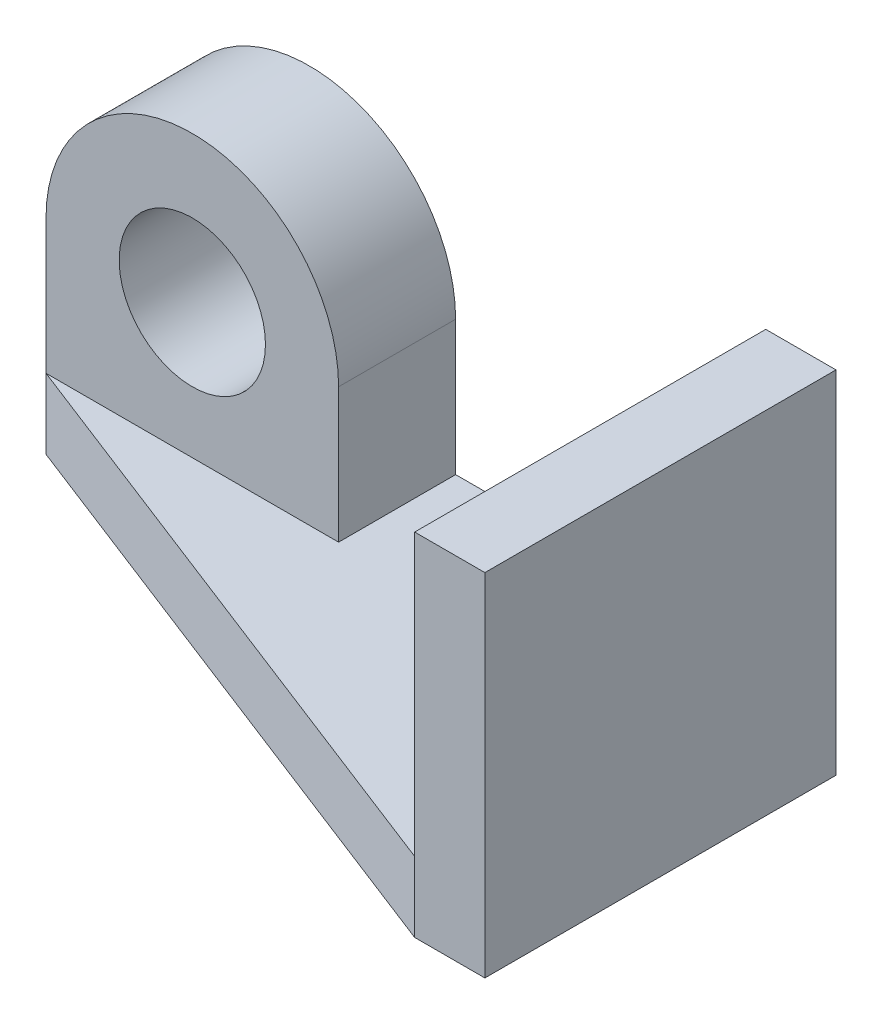
ISO-10303-21;
HEADER;
FILE_DESCRIPTION(('STEP AP214'),'2;1');
FILE_NAME('part.step','',(''),(''),'','','');
FILE_SCHEMA(('AUTOMOTIVE_DESIGN { 1 0 10303 214 1 1 1 1 }'));
ENDSEC;
DATA;
#1=APPLICATION_CONTEXT('core data for automotive mechanical design processes');
#2=APPLICATION_PROTOCOL_DEFINITION('international standard','automotive_design',2000,#1);
#3=PRODUCT_CONTEXT('',#1,'mechanical');
#4=PRODUCT('Part','Part','',(#3));
#5=PRODUCT_RELATED_PRODUCT_CATEGORY('part','',(#4));
#6=PRODUCT_DEFINITION_FORMATION('','',#4);
#7=PRODUCT_DEFINITION_CONTEXT('part definition',#1,'design');
#8=PRODUCT_DEFINITION('design','',#6,#7);
#9=PRODUCT_DEFINITION_SHAPE('','',#8);
#10=(LENGTH_UNIT() NAMED_UNIT(*) SI_UNIT(.MILLI.,.METRE.));
#11=(NAMED_UNIT(*) PLANE_ANGLE_UNIT() SI_UNIT($,.RADIAN.));
#12=(NAMED_UNIT(*) SI_UNIT($,.STERADIAN.) SOLID_ANGLE_UNIT());
#13=UNCERTAINTY_MEASURE_WITH_UNIT(LENGTH_MEASURE(1.E-05),#10,'distance_accuracy_value','');
#14=(GEOMETRIC_REPRESENTATION_CONTEXT(3) GLOBAL_UNCERTAINTY_ASSIGNED_CONTEXT((#13)) GLOBAL_UNIT_ASSIGNED_CONTEXT((#10,
#11,#12)) REPRESENTATION_CONTEXT('',''));
#15=CARTESIAN_POINT('',(0.,0.,0.));
#16=DIRECTION('',(0.,0.,1.));
#17=DIRECTION('',(1.,0.,0.));
#18=AXIS2_PLACEMENT_3D('',#15,#16,#17);
#19=CARTESIAN_POINT('',(103.,12.,60.));
#20=DIRECTION('',(0.,-1.,0.));
#21=DIRECTION('',(1.,0.,0.));
#22=AXIS2_PLACEMENT_3D('',#19,#20,#21);
#23=PLANE('',#22);
#24=DIRECTION('',(1.,0.,0.));
#25=VECTOR('',#24,1.);
#26=CARTESIAN_POINT('',(0.,12.,20.));
#27=LINE('',#26,#25);
#28=CARTESIAN_POINT('',(0.,12.,20.));
#29=VERTEX_POINT('',#28);
#30=CARTESIAN_POINT('',(50.,12.,20.));
#31=VERTEX_POINT('',#30);
#32=EDGE_CURVE('E129',#29,#31,#27,.T.);
#33=ORIENTED_EDGE('',*,*,#32,.F.);
#34=DIRECTION('',(-0.932174412802328,0.,-0.362009480699933));
#35=VECTOR('',#34,1.);
#36=CARTESIAN_POINT('',(0.,12.,20.));
#37=LINE('',#36,#35);
#38=CARTESIAN_POINT('',(103.,12.,60.));
#39=VERTEX_POINT('',#38);
#40=EDGE_CURVE('E158',#39,#29,#37,.T.);
#41=ORIENTED_EDGE('',*,*,#40,.F.);
#42=DIRECTION('',(0.,0.,-1.));
#43=VECTOR('',#42,1.);
#44=CARTESIAN_POINT('',(103.,12.,60.));
#45=LINE('',#44,#43);
#46=CARTESIAN_POINT('',(103.,12.,0.));
#47=VERTEX_POINT('',#46);
#48=EDGE_CURVE('E187',#39,#47,#45,.T.);
#49=ORIENTED_EDGE('',*,*,#48,.T.);
#50=DIRECTION('',(-1.,0.,0.));
#51=VECTOR('',#50,1.);
#52=CARTESIAN_POINT('',(103.,12.,0.));
#53=LINE('',#52,#51);
#54=CARTESIAN_POINT('',(50.,12.,0.));
#55=VERTEX_POINT('',#54);
#56=EDGE_CURVE('E62',#47,#55,#53,.T.);
#57=ORIENTED_EDGE('',*,*,#56,.T.);
#58=DIRECTION('',(0.,0.,-1.));
#59=VECTOR('',#58,1.);
#60=CARTESIAN_POINT('',(50.,12.,20.));
#61=LINE('',#60,#59);
#62=EDGE_CURVE('E57',#31,#55,#61,.T.);
#63=ORIENTED_EDGE('',*,*,#62,.F.);
#64=EDGE_LOOP('',(#33,#41,#49,#57,#63));
#65=FACE_BOUND('',#64,.T.);
#66=ADVANCED_FACE('F42',(#65),#23,.F.);
#67=CARTESIAN_POINT('',(0.,12.,60.));
#68=DIRECTION('',(1.,0.,0.));
#69=DIRECTION('',(0.,1.,0.));
#70=AXIS2_PLACEMENT_3D('',#67,#68,#69);
#71=PLANE('',#70);
#72=DIRECTION('',(0.,0.,-1.));
#73=VECTOR('',#72,1.);
#74=CARTESIAN_POINT('',(0.,0.,60.));
#75=LINE('',#74,#73);
#76=CARTESIAN_POINT('',(0.,0.,20.));
#77=VERTEX_POINT('',#76);
#78=CARTESIAN_POINT('',(0.,0.,0.));
#79=VERTEX_POINT('',#78);
#80=EDGE_CURVE('E11',#77,#79,#75,.T.);
#81=ORIENTED_EDGE('',*,*,#80,.F.);
#82=DIRECTION('',(0.,1.,0.));
#83=VECTOR('',#82,1.);
#84=CARTESIAN_POINT('',(0.,0.,20.));
#85=LINE('',#84,#83);
#86=EDGE_CURVE('E167',#77,#29,#85,.T.);
#87=ORIENTED_EDGE('',*,*,#86,.T.);
#88=DIRECTION('',(0.,-1.,0.));
#89=VECTOR('',#88,1.);
#90=CARTESIAN_POINT('',(0.,35.,20.));
#91=LINE('',#90,#89);
#92=CARTESIAN_POINT('',(0.,35.,20.));
#93=VERTEX_POINT('',#92);
#94=EDGE_CURVE('E131',#93,#29,#91,.T.);
#95=ORIENTED_EDGE('',*,*,#94,.F.);
#96=DIRECTION('',(0.,0.,1.));
#97=VECTOR('',#96,1.);
#98=CARTESIAN_POINT('',(0.,35.,0.));
#99=LINE('',#98,#97);
#100=CARTESIAN_POINT('',(0.,35.,0.));
#101=VERTEX_POINT('',#100);
#102=EDGE_CURVE('E122',#101,#93,#99,.T.);
#103=ORIENTED_EDGE('',*,*,#102,.F.);
#104=DIRECTION('',(0.,-1.,0.));
#105=VECTOR('',#104,1.);
#106=CARTESIAN_POINT('',(0.,12.,0.));
#107=LINE('',#106,#105);
#108=EDGE_CURVE('E190',#101,#79,#107,.T.);
#109=ORIENTED_EDGE('',*,*,#108,.T.);
#110=EDGE_LOOP('',(#81,#87,#95,#103,#109));
#111=FACE_BOUND('',#110,.T.);
#112=ADVANCED_FACE('F244',(#111),#71,.F.);
#113=CARTESIAN_POINT('',(0.,0.,60.));
#114=DIRECTION('',(0.,1.,0.));
#115=DIRECTION('',(0.,0.,1.));
#116=AXIS2_PLACEMENT_3D('',#113,#114,#115);
#117=PLANE('',#116);
#118=DIRECTION('',(1.,0.,0.));
#119=VECTOR('',#118,1.);
#120=CARTESIAN_POINT('',(0.,0.,60.));
#121=LINE('',#120,#119);
#122=CARTESIAN_POINT('',(103.,0.,60.));
#123=VERTEX_POINT('',#122);
#124=CARTESIAN_POINT('',(115.,0.,60.));
#125=VERTEX_POINT('',#124);
#126=EDGE_CURVE('E173',#123,#125,#121,.T.);
#127=ORIENTED_EDGE('',*,*,#126,.F.);
#128=DIRECTION('',(-0.932174412802328,0.,-0.362009480699933));
#129=VECTOR('',#128,1.);
#130=CARTESIAN_POINT('',(0.,0.,20.));
#131=LINE('',#130,#129);
#132=EDGE_CURVE('E159',#123,#77,#131,.T.);
#133=ORIENTED_EDGE('',*,*,#132,.T.);
#134=ORIENTED_EDGE('',*,*,#80,.T.);
#135=DIRECTION('',(1.,0.,0.));
#136=VECTOR('',#135,1.);
#137=CARTESIAN_POINT('',(0.,0.,0.));
#138=LINE('',#137,#136);
#139=CARTESIAN_POINT('',(115.,0.,0.));
#140=VERTEX_POINT('',#139);
#141=EDGE_CURVE('E194',#79,#140,#138,.T.);
#142=ORIENTED_EDGE('',*,*,#141,.T.);
#143=DIRECTION('',(0.,0.,-1.));
#144=VECTOR('',#143,1.);
#145=CARTESIAN_POINT('',(115.,0.,60.));
#146=LINE('',#145,#144);
#147=EDGE_CURVE('E50',#125,#140,#146,.T.);
#148=ORIENTED_EDGE('',*,*,#147,.F.);
#149=EDGE_LOOP('',(#127,#133,#134,#142,#148));
#150=FACE_BOUND('',#149,.T.);
#151=ADVANCED_FACE('F240',(#150),#117,.F.);
#152=CARTESIAN_POINT('',(115.,0.,60.));
#153=DIRECTION('',(-1.,0.,0.));
#154=DIRECTION('',(0.,0.,1.));
#155=AXIS2_PLACEMENT_3D('',#152,#153,#154);
#156=PLANE('',#155);
#157=DIRECTION('',(0.,1.,0.));
#158=VECTOR('',#157,1.);
#159=CARTESIAN_POINT('',(115.,0.,0.));
#160=LINE('',#159,#158);
#161=CARTESIAN_POINT('',(115.,60.,0.));
#162=VERTEX_POINT('',#161);
#163=EDGE_CURVE('E197',#140,#162,#160,.T.);
#164=ORIENTED_EDGE('',*,*,#163,.T.);
#165=DIRECTION('',(0.,0.,-1.));
#166=VECTOR('',#165,1.);
#167=CARTESIAN_POINT('',(115.,60.,60.));
#168=LINE('',#167,#166);
#169=CARTESIAN_POINT('',(115.,60.,60.));
#170=VERTEX_POINT('',#169);
#171=EDGE_CURVE('E211',#170,#162,#168,.T.);
#172=ORIENTED_EDGE('',*,*,#171,.F.);
#173=DIRECTION('',(0.,1.,0.));
#174=VECTOR('',#173,1.);
#175=CARTESIAN_POINT('',(115.,0.,60.));
#176=LINE('',#175,#174);
#177=EDGE_CURVE('E176',#125,#170,#176,.T.);
#178=ORIENTED_EDGE('',*,*,#177,.F.);
#179=ORIENTED_EDGE('',*,*,#147,.T.);
#180=EDGE_LOOP('',(#164,#172,#178,#179));
#181=FACE_BOUND('',#180,.T.);
#182=ADVANCED_FACE('F220',(#181),#156,.F.);
#183=CARTESIAN_POINT('',(115.,60.,60.));
#184=DIRECTION('',(0.,-1.,0.));
#185=DIRECTION('',(0.,0.,-1.));
#186=AXIS2_PLACEMENT_3D('',#183,#184,#185);
#187=PLANE('',#186);
#188=DIRECTION('',(-1.,0.,0.));
#189=VECTOR('',#188,1.);
#190=CARTESIAN_POINT('',(115.,60.,0.));
#191=LINE('',#190,#189);
#192=CARTESIAN_POINT('',(103.,60.,0.));
#193=VERTEX_POINT('',#192);
#194=EDGE_CURVE('E200',#162,#193,#191,.T.);
#195=ORIENTED_EDGE('',*,*,#194,.T.);
#196=DIRECTION('',(0.,0.,-1.));
#197=VECTOR('',#196,1.);
#198=CARTESIAN_POINT('',(103.,60.,60.));
#199=LINE('',#198,#197);
#200=CARTESIAN_POINT('',(103.,60.,60.));
#201=VERTEX_POINT('',#200);
#202=EDGE_CURVE('E207',#201,#193,#199,.T.);
#203=ORIENTED_EDGE('',*,*,#202,.F.);
#204=DIRECTION('',(-1.,0.,0.));
#205=VECTOR('',#204,1.);
#206=CARTESIAN_POINT('',(115.,60.,60.));
#207=LINE('',#206,#205);
#208=EDGE_CURVE('E180',#170,#201,#207,.T.);
#209=ORIENTED_EDGE('',*,*,#208,.F.);
#210=ORIENTED_EDGE('',*,*,#171,.T.);
#211=EDGE_LOOP('',(#195,#203,#209,#210));
#212=FACE_BOUND('',#211,.T.);
#213=ADVANCED_FACE('F231',(#212),#187,.F.);
#214=CARTESIAN_POINT('',(103.,60.,60.));
#215=DIRECTION('',(1.,0.,0.));
#216=DIRECTION('',(0.,0.,-1.));
#217=AXIS2_PLACEMENT_3D('',#214,#215,#216);
#218=PLANE('',#217);
#219=DIRECTION('',(0.,-1.,0.));
#220=VECTOR('',#219,1.);
#221=CARTESIAN_POINT('',(103.,60.,0.));
#222=LINE('',#221,#220);
#223=EDGE_CURVE('E177',#193,#47,#222,.T.);
#224=ORIENTED_EDGE('',*,*,#223,.T.);
#225=ORIENTED_EDGE('',*,*,#48,.F.);
#226=DIRECTION('',(0.,-1.,0.));
#227=VECTOR('',#226,1.);
#228=CARTESIAN_POINT('',(103.,60.,60.));
#229=LINE('',#228,#227);
#230=EDGE_CURVE('E183',#201,#39,#229,.T.);
#231=ORIENTED_EDGE('',*,*,#230,.F.);
#232=ORIENTED_EDGE('',*,*,#202,.T.);
#233=EDGE_LOOP('',(#224,#225,#231,#232));
#234=FACE_BOUND('',#233,.T.);
#235=ADVANCED_FACE('F235',(#234),#218,.F.);
#236=CARTESIAN_POINT('',(0.,0.,60.));
#237=DIRECTION('',(0.,0.,1.));
#238=DIRECTION('',(1.,0.,0.));
#239=AXIS2_PLACEMENT_3D('',#236,#237,#238);
#240=PLANE('',#239);
#241=DIRECTION('',(0.,1.,0.));
#242=VECTOR('',#241,1.);
#243=CARTESIAN_POINT('',(103.,0.,60.));
#244=LINE('',#243,#242);
#245=EDGE_CURVE('E163',#123,#39,#244,.T.);
#246=ORIENTED_EDGE('',*,*,#245,.F.);
#247=ORIENTED_EDGE('',*,*,#126,.T.);
#248=ORIENTED_EDGE('',*,*,#177,.T.);
#249=ORIENTED_EDGE('',*,*,#208,.T.);
#250=ORIENTED_EDGE('',*,*,#230,.T.);
#251=EDGE_LOOP('',(#246,#247,#248,#249,#250));
#252=FACE_BOUND('',#251,.T.);
#253=ADVANCED_FACE('F239',(#252),#240,.T.);
#254=CARTESIAN_POINT('',(0.,0.,0.));
#255=DIRECTION('',(0.,0.,1.));
#256=DIRECTION('',(1.,0.,0.));
#257=AXIS2_PLACEMENT_3D('',#254,#255,#256);
#258=PLANE('',#257);
#259=CARTESIAN_POINT('',(25.,35.,0.));
#260=DIRECTION('',(0.,0.,1.));
#261=DIRECTION('',(1.,0.,0.));
#262=AXIS2_PLACEMENT_3D('',#259,#260,#261);
#263=CIRCLE('',#262,12.5);
#264=CARTESIAN_POINT('',(37.5,35.,0.));
#265=VERTEX_POINT('',#264);
#266=EDGE_CURVE('E138',#265,#265,#263,.T.);
#267=ORIENTED_EDGE('',*,*,#266,.T.);
#268=EDGE_LOOP('',(#267));
#269=FACE_BOUND('',#268,.T.);
#270=ORIENTED_EDGE('',*,*,#56,.F.);
#271=ORIENTED_EDGE('',*,*,#223,.F.);
#272=ORIENTED_EDGE('',*,*,#194,.F.);
#273=ORIENTED_EDGE('',*,*,#163,.F.);
#274=ORIENTED_EDGE('',*,*,#141,.F.);
#275=ORIENTED_EDGE('',*,*,#108,.F.);
#276=CARTESIAN_POINT('',(25.,35.,0.));
#277=DIRECTION('',(0.,0.,1.));
#278=DIRECTION('',(1.,0.,0.));
#279=AXIS2_PLACEMENT_3D('',#276,#277,#278);
#280=CIRCLE('',#279,25.);
#281=CARTESIAN_POINT('',(50.,35.,0.));
#282=VERTEX_POINT('',#281);
#283=EDGE_CURVE('E137',#282,#101,#280,.T.);
#284=ORIENTED_EDGE('',*,*,#283,.F.);
#285=DIRECTION('',(0.,-1.,0.));
#286=VECTOR('',#285,1.);
#287=CARTESIAN_POINT('',(50.,35.,0.));
#288=LINE('',#287,#286);
#289=EDGE_CURVE('E116',#282,#55,#288,.T.);
#290=ORIENTED_EDGE('',*,*,#289,.T.);
#291=EDGE_LOOP('',(#270,#271,#272,#273,#274,#275,#284,#290));
#292=FACE_BOUND('',#291,.T.);
#293=ADVANCED_FACE('F227',(#269,#292),#258,.F.);
#294=CARTESIAN_POINT('',(0.,0.,20.));
#295=DIRECTION('',(0.362009480699933,0.,-0.932174412802328));
#296=DIRECTION('',(-0.932174412802328,0.,-0.362009480699933));
#297=AXIS2_PLACEMENT_3D('',#294,#295,#296);
#298=PLANE('',#297);
#299=ORIENTED_EDGE('',*,*,#40,.T.);
#300=ORIENTED_EDGE('',*,*,#86,.F.);
#301=ORIENTED_EDGE('',*,*,#132,.F.);
#302=ORIENTED_EDGE('',*,*,#245,.T.);
#303=EDGE_LOOP('',(#299,#300,#301,#302));
#304=FACE_BOUND('',#303,.T.);
#305=ADVANCED_FACE('F245',(#304),#298,.F.);
#306=CARTESIAN_POINT('',(0.,35.,20.));
#307=DIRECTION('',(0.,0.,-1.));
#308=DIRECTION('',(-1.,0.,0.));
#309=AXIS2_PLACEMENT_3D('',#306,#307,#308);
#310=PLANE('',#309);
#311=CARTESIAN_POINT('',(25.,35.,20.));
#312=DIRECTION('',(0.,0.,1.));
#313=DIRECTION('',(1.,0.,0.));
#314=AXIS2_PLACEMENT_3D('',#311,#312,#313);
#315=CIRCLE('',#314,12.5);
#316=CARTESIAN_POINT('',(37.5,35.,20.));
#317=VERTEX_POINT('',#316);
#318=EDGE_CURVE('E144',#317,#317,#315,.T.);
#319=ORIENTED_EDGE('',*,*,#318,.F.);
#320=EDGE_LOOP('',(#319));
#321=FACE_BOUND('',#320,.T.);
#322=ORIENTED_EDGE('',*,*,#32,.T.);
#323=DIRECTION('',(0.,-1.,0.));
#324=VECTOR('',#323,1.);
#325=CARTESIAN_POINT('',(50.,35.,20.));
#326=LINE('',#325,#324);
#327=CARTESIAN_POINT('',(50.,35.,20.));
#328=VERTEX_POINT('',#327);
#329=EDGE_CURVE('E114',#328,#31,#326,.T.);
#330=ORIENTED_EDGE('',*,*,#329,.F.);
#331=CARTESIAN_POINT('',(25.,35.,20.));
#332=DIRECTION('',(0.,0.,1.));
#333=DIRECTION('',(1.,0.,0.));
#334=AXIS2_PLACEMENT_3D('',#331,#332,#333);
#335=CIRCLE('',#334,25.);
#336=EDGE_CURVE('E128',#328,#93,#335,.T.);
#337=ORIENTED_EDGE('',*,*,#336,.T.);
#338=ORIENTED_EDGE('',*,*,#94,.T.);
#339=EDGE_LOOP('',(#322,#330,#337,#338));
#340=FACE_BOUND('',#339,.T.);
#341=ADVANCED_FACE('F126',(#321,#340),#310,.F.);
#342=CARTESIAN_POINT('',(50.,35.,20.));
#343=DIRECTION('',(-1.,0.,0.));
#344=DIRECTION('',(0.,-1.,0.));
#345=AXIS2_PLACEMENT_3D('',#342,#343,#344);
#346=PLANE('',#345);
#347=ORIENTED_EDGE('',*,*,#62,.T.);
#348=ORIENTED_EDGE('',*,*,#289,.F.);
#349=DIRECTION('',(0.,0.,-1.));
#350=VECTOR('',#349,1.);
#351=CARTESIAN_POINT('',(50.,35.,20.));
#352=LINE('',#351,#350);
#353=EDGE_CURVE('E111',#328,#282,#352,.T.);
#354=ORIENTED_EDGE('',*,*,#353,.F.);
#355=ORIENTED_EDGE('',*,*,#329,.T.);
#356=EDGE_LOOP('',(#347,#348,#354,#355));
#357=FACE_BOUND('',#356,.T.);
#358=ADVANCED_FACE('F113',(#357),#346,.F.);
#359=CARTESIAN_POINT('',(25.,35.,0.));
#360=DIRECTION('',(0.,0.,1.));
#361=DIRECTION('',(1.,0.,0.));
#362=AXIS2_PLACEMENT_3D('',#359,#360,#361);
#363=CYLINDRICAL_SURFACE('',#362,25.);
#364=ORIENTED_EDGE('',*,*,#336,.F.);
#365=ORIENTED_EDGE('',*,*,#353,.T.);
#366=ORIENTED_EDGE('',*,*,#283,.T.);
#367=ORIENTED_EDGE('',*,*,#102,.T.);
#368=EDGE_LOOP('',(#364,#365,#366,#367));
#369=FACE_BOUND('',#368,.T.);
#370=ADVANCED_FACE('F134',(#369),#363,.T.);
#371=CARTESIAN_POINT('',(25.,35.,0.));
#372=DIRECTION('',(0.,0.,1.));
#373=DIRECTION('',(1.,0.,0.));
#374=AXIS2_PLACEMENT_3D('',#371,#372,#373);
#375=CYLINDRICAL_SURFACE('',#374,12.5);
#376=ORIENTED_EDGE('',*,*,#266,.F.);
#377=EDGE_LOOP('',(#376));
#378=FACE_BOUND('',#377,.T.);
#379=ORIENTED_EDGE('',*,*,#318,.T.);
#380=EDGE_LOOP('',(#379));
#381=FACE_BOUND('',#380,.T.);
#382=ADVANCED_FACE('F276',(#378,#381),#375,.F.);
#383=CLOSED_SHELL('',(#66,#112,#151,#182,#213,#235,#253,#293,#305,#341,#358,#370,#382));
#384=MANIFOLD_SOLID_BREP('B2',#383);
#385=ADVANCED_BREP_SHAPE_REPRESENTATION('',(#18,#384),#14);
#386=SHAPE_DEFINITION_REPRESENTATION(#9,#385);
ENDSEC;
END-ISO-10303-21;
